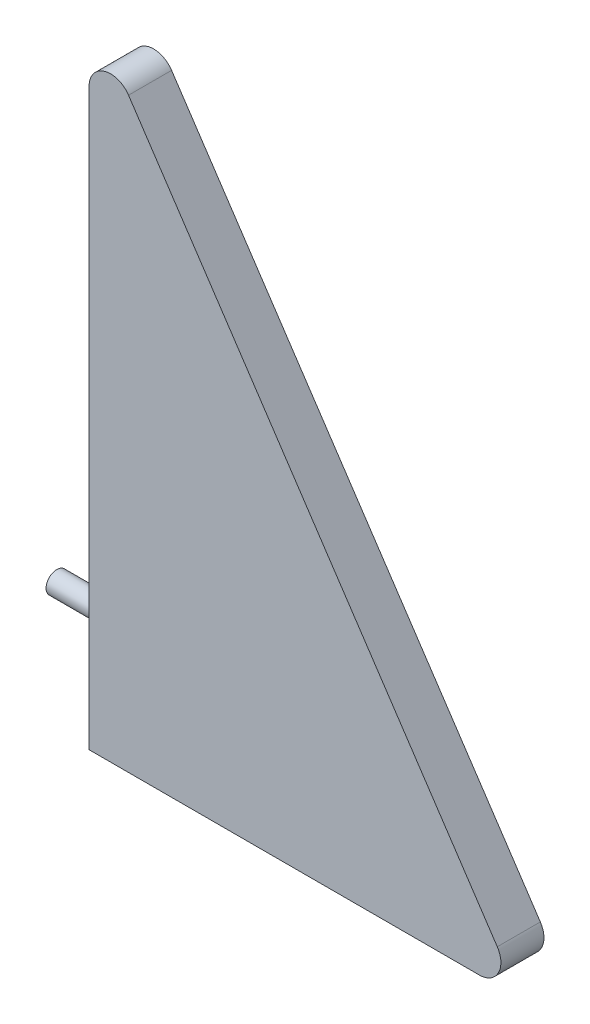
ISO-10303-21;
HEADER;
FILE_DESCRIPTION(('STEP AP214'),'2;1');
FILE_NAME('part.step','',(''),(''),'','','');
FILE_SCHEMA(('AUTOMOTIVE_DESIGN { 1 0 10303 214 1 1 1 1 }'));
ENDSEC;
DATA;
#1=APPLICATION_CONTEXT('core data for automotive mechanical design processes');
#2=APPLICATION_PROTOCOL_DEFINITION('international standard','automotive_design',2000,#1);
#3=PRODUCT_CONTEXT('',#1,'mechanical');
#4=PRODUCT('Part','Part','',(#3));
#5=PRODUCT_RELATED_PRODUCT_CATEGORY('part','',(#4));
#6=PRODUCT_DEFINITION_FORMATION('','',#4);
#7=PRODUCT_DEFINITION_CONTEXT('part definition',#1,'design');
#8=PRODUCT_DEFINITION('design','',#6,#7);
#9=PRODUCT_DEFINITION_SHAPE('','',#8);
#10=(LENGTH_UNIT() NAMED_UNIT(*) SI_UNIT(.MILLI.,.METRE.));
#11=(NAMED_UNIT(*) PLANE_ANGLE_UNIT() SI_UNIT($,.RADIAN.));
#12=(NAMED_UNIT(*) SI_UNIT($,.STERADIAN.) SOLID_ANGLE_UNIT());
#13=UNCERTAINTY_MEASURE_WITH_UNIT(LENGTH_MEASURE(1.E-05),#10,'distance_accuracy_value','');
#14=(GEOMETRIC_REPRESENTATION_CONTEXT(3) GLOBAL_UNCERTAINTY_ASSIGNED_CONTEXT((#13)) GLOBAL_UNIT_ASSIGNED_CONTEXT((#10,
#11,#12)) REPRESENTATION_CONTEXT('',''));
#15=CARTESIAN_POINT('',(0.,0.,0.));
#16=DIRECTION('',(0.,0.,1.));
#17=DIRECTION('',(1.,0.,0.));
#18=AXIS2_PLACEMENT_3D('',#15,#16,#17);
#19=CARTESIAN_POINT('',(0.,2669.7224362268,200.));
#20=DIRECTION('',(1.,0.,0.));
#21=DIRECTION('',(0.,1.,0.));
#22=AXIS2_PLACEMENT_3D('',#19,#20,#21);
#23=PLANE('',#22);
#24=DIRECTION('',(0.,-1.,0.));
#25=VECTOR('',#24,1.);
#26=CARTESIAN_POINT('',(0.,2669.7224362268,0.));
#27=LINE('',#26,#25);
#28=CARTESIAN_POINT('',(0.,2669.7224362268,0.));
#29=VERTEX_POINT('',#28);
#30=CARTESIAN_POINT('',(0.,0.,0.));
#31=VERTEX_POINT('',#30);
#32=EDGE_CURVE('E108',#29,#31,#27,.T.);
#33=ORIENTED_EDGE('',*,*,#32,.T.);
#34=DIRECTION('',(0.,0.,-1.));
#35=VECTOR('',#34,1.);
#36=CARTESIAN_POINT('',(0.,0.,200.));
#37=LINE('',#36,#35);
#38=CARTESIAN_POINT('',(0.,0.,200.));
#39=VERTEX_POINT('',#38);
#40=EDGE_CURVE('E40',#39,#31,#37,.T.);
#41=ORIENTED_EDGE('',*,*,#40,.F.);
#42=DIRECTION('',(0.,-1.,0.));
#43=VECTOR('',#42,1.);
#44=CARTESIAN_POINT('',(0.,2669.7224362268,200.));
#45=LINE('',#44,#43);
#46=CARTESIAN_POINT('',(0.,2669.7224362268,200.));
#47=VERTEX_POINT('',#46);
#48=EDGE_CURVE('E117',#47,#39,#45,.T.);
#49=ORIENTED_EDGE('',*,*,#48,.F.);
#50=DIRECTION('',(0.,0.,-1.));
#51=VECTOR('',#50,1.);
#52=CARTESIAN_POINT('',(0.,2669.7224362268,200.));
#53=LINE('',#52,#51);
#54=EDGE_CURVE('E104',#47,#29,#53,.T.);
#55=ORIENTED_EDGE('',*,*,#54,.T.);
#56=EDGE_LOOP('',(#33,#41,#49,#55));
#57=FACE_BOUND('',#56,.T.);
#58=CARTESIAN_POINT('',(0.,500.,99.9999999999999));
#59=DIRECTION('',(1.,0.,0.));
#60=DIRECTION('',(0.,1.,0.));
#61=AXIS2_PLACEMENT_3D('',#58,#59,#60);
#62=CIRCLE('',#61,50.);
#63=CARTESIAN_POINT('',(0.,550.,99.9999999999999));
#64=VERTEX_POINT('',#63);
#65=EDGE_CURVE('E11',#64,#64,#62,.F.);
#66=ORIENTED_EDGE('',*,*,#65,.F.);
#67=EDGE_LOOP('',(#66));
#68=FACE_BOUND('',#67,.T.);
#69=ADVANCED_FACE('F32',(#57,#68),#23,.F.);
#70=CARTESIAN_POINT('',(0.,0.,200.));
#71=DIRECTION('',(0.,1.,0.));
#72=DIRECTION('',(-1.,0.,0.));
#73=AXIS2_PLACEMENT_3D('',#70,#71,#72);
#74=PLANE('',#73);
#75=DIRECTION('',(1.,0.,0.));
#76=VECTOR('',#75,1.);
#77=CARTESIAN_POINT('',(0.,0.,0.));
#78=LINE('',#77,#76);
#79=CARTESIAN_POINT('',(1813.14829081787,0.,0.));
#80=VERTEX_POINT('',#79);
#81=EDGE_CURVE('E111',#31,#80,#78,.T.);
#82=ORIENTED_EDGE('',*,*,#81,.T.);
#83=DIRECTION('',(0.,0.,-1.));
#84=VECTOR('',#83,1.);
#85=CARTESIAN_POINT('',(1813.14829081787,0.,200.));
#86=LINE('',#85,#84);
#87=CARTESIAN_POINT('',(1813.14829081787,0.,200.));
#88=VERTEX_POINT('',#87);
#89=EDGE_CURVE('E99',#88,#80,#86,.T.);
#90=ORIENTED_EDGE('',*,*,#89,.F.);
#91=DIRECTION('',(1.,0.,0.));
#92=VECTOR('',#91,1.);
#93=CARTESIAN_POINT('',(0.,0.,200.));
#94=LINE('',#93,#92);
#95=EDGE_CURVE('E83',#39,#88,#94,.T.);
#96=ORIENTED_EDGE('',*,*,#95,.F.);
#97=ORIENTED_EDGE('',*,*,#40,.T.);
#98=EDGE_LOOP('',(#82,#90,#96,#97));
#99=FACE_BOUND('',#98,.T.);
#100=ADVANCED_FACE('F121',(#99),#74,.F.);
#101=CARTESIAN_POINT('',(1813.14829081787,100.,200.));
#102=DIRECTION('',(0.,0.,-1.));
#103=DIRECTION('',(-1.,0.,0.));
#104=AXIS2_PLACEMENT_3D('',#101,#102,#103);
#105=CYLINDRICAL_SURFACE('',#104,99.9999999999999);
#106=CARTESIAN_POINT('',(1813.14829081787,100.,0.));
#107=DIRECTION('',(0.,0.,1.));
#108=DIRECTION('',(1.,0.,0.));
#109=AXIS2_PLACEMENT_3D('',#106,#107,#108);
#110=CIRCLE('',#109,99.9999999999999);
#111=CARTESIAN_POINT('',(1896.35332025165,155.470019622523,0.));
#112=VERTEX_POINT('',#111);
#113=EDGE_CURVE('E98',#80,#112,#110,.T.);
#114=ORIENTED_EDGE('',*,*,#113,.T.);
#115=DIRECTION('',(0.,0.,-1.));
#116=VECTOR('',#115,1.);
#117=CARTESIAN_POINT('',(1896.35332025165,155.470019622523,200.));
#118=LINE('',#117,#116);
#119=CARTESIAN_POINT('',(1896.35332025165,155.470019622523,200.));
#120=VERTEX_POINT('',#119);
#121=EDGE_CURVE('E95',#120,#112,#118,.T.);
#122=ORIENTED_EDGE('',*,*,#121,.F.);
#123=CARTESIAN_POINT('',(1813.14829081787,100.,200.));
#124=DIRECTION('',(0.,0.,1.));
#125=DIRECTION('',(1.,0.,0.));
#126=AXIS2_PLACEMENT_3D('',#123,#124,#125);
#127=CIRCLE('',#126,99.9999999999999);
#128=EDGE_CURVE('E87',#88,#120,#127,.T.);
#129=ORIENTED_EDGE('',*,*,#128,.F.);
#130=ORIENTED_EDGE('',*,*,#89,.T.);
#131=EDGE_LOOP('',(#114,#122,#129,#130));
#132=FACE_BOUND('',#131,.T.);
#133=ADVANCED_FACE('F96',(#132),#105,.T.);
#134=CARTESIAN_POINT('',(1896.35332025165,155.470019622523,200.));
#135=DIRECTION('',(-0.832050294337844,-0.554700196225229,0.));
#136=DIRECTION('',(0.554700196225229,-0.832050294337844,0.));
#137=AXIS2_PLACEMENT_3D('',#134,#135,#136);
#138=PLANE('',#137);
#139=DIRECTION('',(-0.554700196225229,0.832050294337844,0.));
#140=VECTOR('',#139,1.);
#141=CARTESIAN_POINT('',(1896.35332025165,155.470019622523,0.));
#142=LINE('',#141,#140);
#143=CARTESIAN_POINT('',(183.205029433785,2725.19245584932,0.));
#144=VERTEX_POINT('',#143);
#145=EDGE_CURVE('E68',#112,#144,#142,.T.);
#146=ORIENTED_EDGE('',*,*,#145,.T.);
#147=DIRECTION('',(0.,0.,-1.));
#148=VECTOR('',#147,1.);
#149=CARTESIAN_POINT('',(183.205029433785,2725.19245584932,200.));
#150=LINE('',#149,#148);
#151=CARTESIAN_POINT('',(183.205029433785,2725.19245584932,200.));
#152=VERTEX_POINT('',#151);
#153=EDGE_CURVE('E100',#152,#144,#150,.T.);
#154=ORIENTED_EDGE('',*,*,#153,.F.);
#155=DIRECTION('',(-0.554700196225229,0.832050294337844,0.));
#156=VECTOR('',#155,1.);
#157=CARTESIAN_POINT('',(1896.35332025165,155.470019622523,200.));
#158=LINE('',#157,#156);
#159=EDGE_CURVE('E91',#120,#152,#158,.T.);
#160=ORIENTED_EDGE('',*,*,#159,.F.);
#161=ORIENTED_EDGE('',*,*,#121,.T.);
#162=EDGE_LOOP('',(#146,#154,#160,#161));
#163=FACE_BOUND('',#162,.T.);
#164=ADVANCED_FACE('F102',(#163),#138,.F.);
#165=CARTESIAN_POINT('',(100.,2669.7224362268,200.));
#166=DIRECTION('',(0.,0.,-1.));
#167=DIRECTION('',(-1.,0.,0.));
#168=AXIS2_PLACEMENT_3D('',#165,#166,#167);
#169=CYLINDRICAL_SURFACE('',#168,100.);
#170=CARTESIAN_POINT('',(100.,2669.7224362268,0.));
#171=DIRECTION('',(0.,0.,1.));
#172=DIRECTION('',(1.,0.,0.));
#173=AXIS2_PLACEMENT_3D('',#170,#171,#172);
#174=CIRCLE('',#173,100.);
#175=EDGE_CURVE('E74',#144,#29,#174,.T.);
#176=ORIENTED_EDGE('',*,*,#175,.T.);
#177=ORIENTED_EDGE('',*,*,#54,.F.);
#178=CARTESIAN_POINT('',(100.,2669.7224362268,200.));
#179=DIRECTION('',(0.,0.,1.));
#180=DIRECTION('',(1.,0.,0.));
#181=AXIS2_PLACEMENT_3D('',#178,#179,#180);
#182=CIRCLE('',#181,100.);
#183=EDGE_CURVE('E48',#152,#47,#182,.T.);
#184=ORIENTED_EDGE('',*,*,#183,.F.);
#185=ORIENTED_EDGE('',*,*,#153,.T.);
#186=EDGE_LOOP('',(#176,#177,#184,#185));
#187=FACE_BOUND('',#186,.T.);
#188=ADVANCED_FACE('F138',(#187),#169,.T.);
#189=CARTESIAN_POINT('',(1813.14829081787,100.,200.));
#190=DIRECTION('',(0.,0.,1.));
#191=DIRECTION('',(1.,0.,0.));
#192=AXIS2_PLACEMENT_3D('',#189,#190,#191);
#193=PLANE('',#192);
#194=ORIENTED_EDGE('',*,*,#48,.T.);
#195=ORIENTED_EDGE('',*,*,#95,.T.);
#196=ORIENTED_EDGE('',*,*,#128,.T.);
#197=ORIENTED_EDGE('',*,*,#159,.T.);
#198=ORIENTED_EDGE('',*,*,#183,.T.);
#199=EDGE_LOOP('',(#194,#195,#196,#197,#198));
#200=FACE_BOUND('',#199,.T.);
#201=ADVANCED_FACE('F89',(#200),#193,.T.);
#202=CARTESIAN_POINT('',(1813.14829081787,100.,0.));
#203=DIRECTION('',(0.,0.,1.));
#204=DIRECTION('',(1.,0.,0.));
#205=AXIS2_PLACEMENT_3D('',#202,#203,#204);
#206=PLANE('',#205);
#207=ORIENTED_EDGE('',*,*,#32,.F.);
#208=ORIENTED_EDGE('',*,*,#175,.F.);
#209=ORIENTED_EDGE('',*,*,#145,.F.);
#210=ORIENTED_EDGE('',*,*,#113,.F.);
#211=ORIENTED_EDGE('',*,*,#81,.F.);
#212=EDGE_LOOP('',(#207,#208,#209,#210,#211));
#213=FACE_BOUND('',#212,.T.);
#214=ADVANCED_FACE('F127',(#213),#206,.F.);
#215=CARTESIAN_POINT('',(-250.,500.,99.9999999999999));
#216=DIRECTION('',(1.,0.,0.));
#217=DIRECTION('',(0.,1.,0.));
#218=AXIS2_PLACEMENT_3D('',#215,#216,#217);
#219=CYLINDRICAL_SURFACE('',#218,50.);
#220=CARTESIAN_POINT('',(-250.,500.,99.9999999999999));
#221=DIRECTION('',(-1.,0.,0.));
#222=DIRECTION('',(0.,-1.,0.));
#223=AXIS2_PLACEMENT_3D('',#220,#221,#222);
#224=CIRCLE('',#223,50.);
#225=CARTESIAN_POINT('',(-250.,450.,99.9999999999999));
#226=VERTEX_POINT('',#225);
#227=EDGE_CURVE('E112',#226,#226,#224,.T.);
#228=ORIENTED_EDGE('',*,*,#227,.F.);
#229=EDGE_LOOP('',(#228));
#230=FACE_BOUND('',#229,.T.);
#231=ORIENTED_EDGE('',*,*,#65,.T.);
#232=EDGE_LOOP('',(#231));
#233=FACE_BOUND('',#232,.T.);
#234=ADVANCED_FACE('F129',(#230,#233),#219,.T.);
#235=CARTESIAN_POINT('',(-250.,500.,99.9999999999999));
#236=DIRECTION('',(-1.,0.,0.));
#237=DIRECTION('',(0.,-1.,0.));
#238=AXIS2_PLACEMENT_3D('',#235,#236,#237);
#239=PLANE('',#238);
#240=ORIENTED_EDGE('',*,*,#227,.T.);
#241=EDGE_LOOP('',(#240));
#242=FACE_BOUND('',#241,.T.);
#243=ADVANCED_FACE('F135',(#242),#239,.T.);
#244=CLOSED_SHELL('',(#69,#100,#133,#164,#188,#201,#214,#234,#243));
#245=MANIFOLD_SOLID_BREP('B2',#244);
#246=ADVANCED_BREP_SHAPE_REPRESENTATION('',(#18,#245),#14);
#247=SHAPE_DEFINITION_REPRESENTATION(#9,#246);
ENDSEC;
END-ISO-10303-21;
